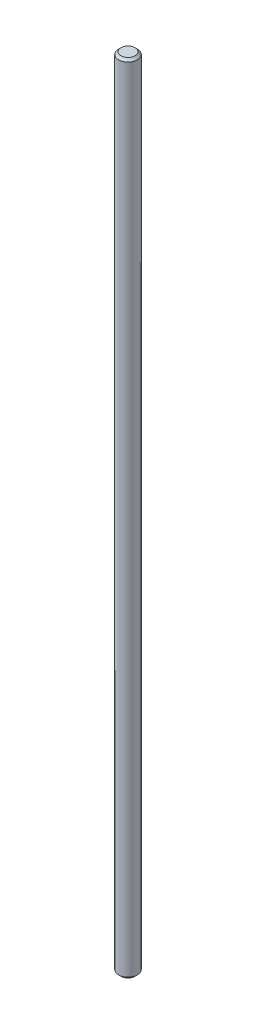
ISO-10303-21;
HEADER;
FILE_DESCRIPTION(('STEP AP214'),'2;1');
FILE_NAME('part.step','',(''),(''),'','','');
FILE_SCHEMA(('AUTOMOTIVE_DESIGN { 1 0 10303 214 1 1 1 1 }'));
ENDSEC;
DATA;
#1=APPLICATION_CONTEXT('core data for automotive mechanical design processes');
#2=APPLICATION_PROTOCOL_DEFINITION('international standard','automotive_design',2000,#1);
#3=PRODUCT_CONTEXT('',#1,'mechanical');
#4=PRODUCT('Part','Part','',(#3));
#5=PRODUCT_RELATED_PRODUCT_CATEGORY('part','',(#4));
#6=PRODUCT_DEFINITION_FORMATION('','',#4);
#7=PRODUCT_DEFINITION_CONTEXT('part definition',#1,'design');
#8=PRODUCT_DEFINITION('design','',#6,#7);
#9=PRODUCT_DEFINITION_SHAPE('','',#8);
#10=(LENGTH_UNIT() NAMED_UNIT(*) SI_UNIT(.MILLI.,.METRE.));
#11=(NAMED_UNIT(*) PLANE_ANGLE_UNIT() SI_UNIT($,.RADIAN.));
#12=(NAMED_UNIT(*) SI_UNIT($,.STERADIAN.) SOLID_ANGLE_UNIT());
#13=UNCERTAINTY_MEASURE_WITH_UNIT(LENGTH_MEASURE(1.E-05),#10,'distance_accuracy_value','');
#14=(GEOMETRIC_REPRESENTATION_CONTEXT(3) GLOBAL_UNCERTAINTY_ASSIGNED_CONTEXT((#13)) GLOBAL_UNIT_ASSIGNED_CONTEXT((#10,
#11,#12)) REPRESENTATION_CONTEXT('',''));
#15=CARTESIAN_POINT('',(0.,0.,0.));
#16=DIRECTION('',(0.,0.,1.));
#17=DIRECTION('',(1.,0.,0.));
#18=AXIS2_PLACEMENT_3D('',#15,#16,#17);
#19=CARTESIAN_POINT('',(0.,0.,0.));
#20=DIRECTION('',(0.,1.,0.));
#21=DIRECTION('',(0.,0.,1.));
#22=AXIS2_PLACEMENT_3D('',#19,#20,#21);
#23=CYLINDRICAL_SURFACE('',#22,4.);
#24=CARTESIAN_POINT('',(0.,1.00000000000003,0.));
#25=DIRECTION('',(0.,-1.,0.));
#26=DIRECTION('',(0.,0.,-1.));
#27=AXIS2_PLACEMENT_3D('',#24,#25,#26);
#28=CIRCLE('',#27,4.);
#29=CARTESIAN_POINT('',(0.,1.00000000000003,-4.));
#30=VERTEX_POINT('',#29);
#31=EDGE_CURVE('E49',#30,#30,#28,.F.);
#32=ORIENTED_EDGE('',*,*,#31,.T.);
#33=EDGE_LOOP('',(#32));
#34=FACE_BOUND('',#33,.T.);
#35=CARTESIAN_POINT('',(0.,339.,0.));
#36=DIRECTION('',(0.,-1.,0.));
#37=DIRECTION('',(0.,0.,-1.));
#38=AXIS2_PLACEMENT_3D('',#35,#36,#37);
#39=CIRCLE('',#38,4.);
#40=CARTESIAN_POINT('',(0.,339.,-4.));
#41=VERTEX_POINT('',#40);
#42=EDGE_CURVE('E53',#41,#41,#39,.T.);
#43=ORIENTED_EDGE('',*,*,#42,.T.);
#44=EDGE_LOOP('',(#43));
#45=FACE_BOUND('',#44,.T.);
#46=ADVANCED_FACE('F37',(#34,#45),#23,.T.);
#47=CARTESIAN_POINT('',(0.,0.,0.));
#48=DIRECTION('',(0.,-1.,0.));
#49=DIRECTION('',(0.,0.,-1.));
#50=AXIS2_PLACEMENT_3D('',#47,#48,#49);
#51=PLANE('',#50);
#52=CARTESIAN_POINT('',(0.,0.,0.));
#53=DIRECTION('',(0.,-1.,0.));
#54=DIRECTION('',(0.,0.,-1.));
#55=AXIS2_PLACEMENT_3D('',#52,#53,#54);
#56=CIRCLE('',#55,2.99999999999998);
#57=CARTESIAN_POINT('',(0.,0.,-2.99999999999998));
#58=VERTEX_POINT('',#57);
#59=EDGE_CURVE('E45',#58,#58,#56,.T.);
#60=ORIENTED_EDGE('',*,*,#59,.T.);
#61=EDGE_LOOP('',(#60));
#62=FACE_BOUND('',#61,.T.);
#63=ADVANCED_FACE('F69',(#62),#51,.T.);
#64=CARTESIAN_POINT('',(0.,340.,0.));
#65=DIRECTION('',(0.,-1.,0.));
#66=DIRECTION('',(0.,0.,-1.));
#67=AXIS2_PLACEMENT_3D('',#64,#65,#66);
#68=PLANE('',#67);
#69=CARTESIAN_POINT('',(0.,340.,0.));
#70=DIRECTION('',(0.,-1.,0.));
#71=DIRECTION('',(0.,0.,-1.));
#72=AXIS2_PLACEMENT_3D('',#69,#70,#71);
#73=CIRCLE('',#72,3.);
#74=CARTESIAN_POINT('',(0.,340.,-3.));
#75=VERTEX_POINT('',#74);
#76=EDGE_CURVE('E10',#75,#75,#73,.F.);
#77=ORIENTED_EDGE('',*,*,#76,.T.);
#78=EDGE_LOOP('',(#77));
#79=FACE_BOUND('',#78,.T.);
#80=ADVANCED_FACE('F66',(#79),#68,.F.);
#81=CARTESIAN_POINT('',(0.,1.00000000000003,0.));
#82=DIRECTION('',(0.,1.,0.));
#83=DIRECTION('',(0.,0.,1.));
#84=AXIS2_PLACEMENT_3D('',#81,#82,#83);
#85=CONICAL_SURFACE('',#84,4.,0.785398163397445);
#86=ORIENTED_EDGE('',*,*,#59,.F.);
#87=EDGE_LOOP('',(#86));
#88=FACE_BOUND('',#87,.T.);
#89=ORIENTED_EDGE('',*,*,#31,.F.);
#90=EDGE_LOOP('',(#89));
#91=FACE_BOUND('',#90,.T.);
#92=ADVANCED_FACE('F62',(#88,#91),#85,.T.);
#93=CARTESIAN_POINT('',(0.,340.,0.));
#94=DIRECTION('',(0.,-1.,0.));
#95=DIRECTION('',(0.,0.,-1.));
#96=AXIS2_PLACEMENT_3D('',#93,#94,#95);
#97=CONICAL_SURFACE('',#96,3.,0.785398163397447);
#98=ORIENTED_EDGE('',*,*,#42,.F.);
#99=EDGE_LOOP('',(#98));
#100=FACE_BOUND('',#99,.T.);
#101=ORIENTED_EDGE('',*,*,#76,.F.);
#102=EDGE_LOOP('',(#101));
#103=FACE_BOUND('',#102,.T.);
#104=ADVANCED_FACE('F40',(#100,#103),#97,.T.);
#105=CLOSED_SHELL('',(#46,#63,#80,#92,#104));
#106=MANIFOLD_SOLID_BREP('B2',#105);
#107=ADVANCED_BREP_SHAPE_REPRESENTATION('',(#18,#106),#14);
#108=SHAPE_DEFINITION_REPRESENTATION(#9,#107);
ENDSEC;
END-ISO-10303-21;
